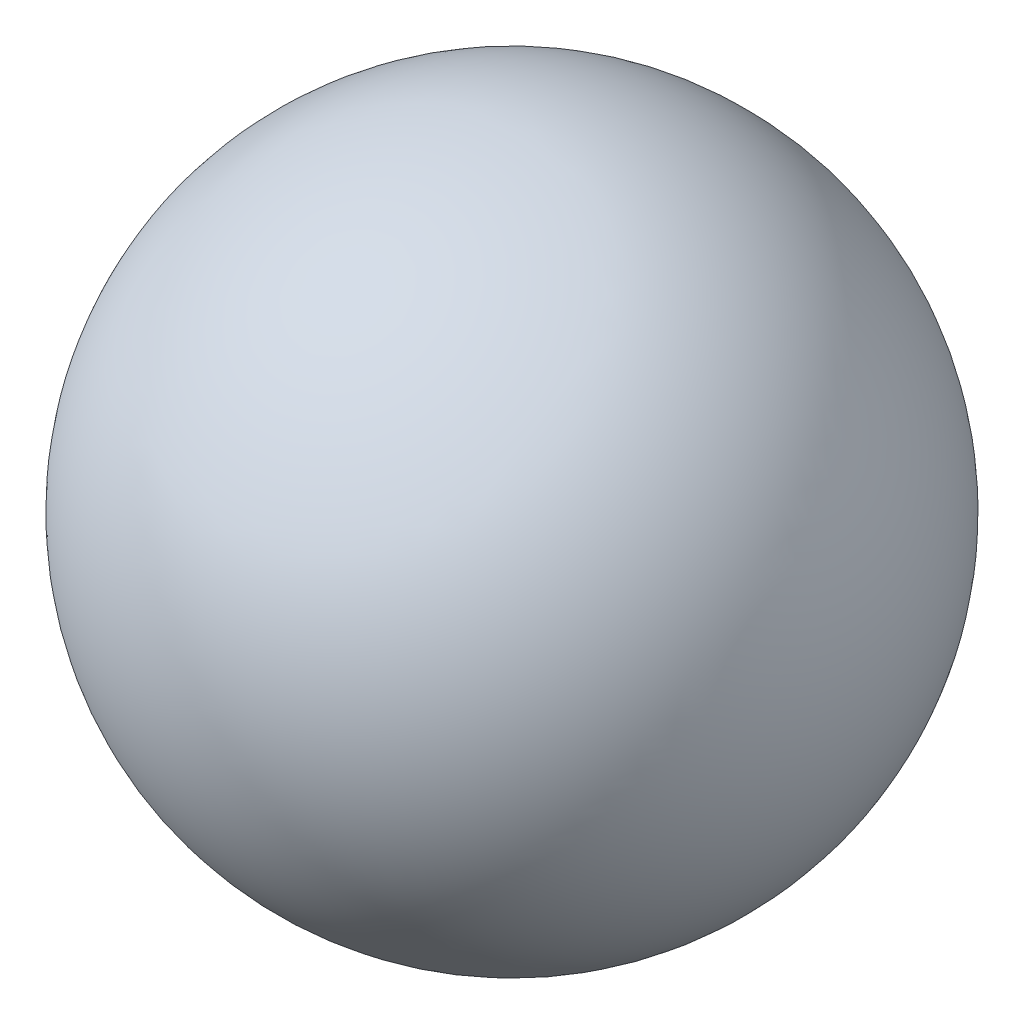
ISO-10303-21;
HEADER;
FILE_DESCRIPTION(('STEP AP214'),'2;1');
FILE_NAME('part.step','',(''),(''),'','','');
FILE_SCHEMA(('AUTOMOTIVE_DESIGN { 1 0 10303 214 1 1 1 1 }'));
ENDSEC;
DATA;
#1=APPLICATION_CONTEXT('core data for automotive mechanical design processes');
#2=APPLICATION_PROTOCOL_DEFINITION('international standard','automotive_design',2000,#1);
#3=PRODUCT_CONTEXT('',#1,'mechanical');
#4=PRODUCT('Part','Part','',(#3));
#5=PRODUCT_RELATED_PRODUCT_CATEGORY('part','',(#4));
#6=PRODUCT_DEFINITION_FORMATION('','',#4);
#7=PRODUCT_DEFINITION_CONTEXT('part definition',#1,'design');
#8=PRODUCT_DEFINITION('design','',#6,#7);
#9=PRODUCT_DEFINITION_SHAPE('','',#8);
#10=(LENGTH_UNIT() NAMED_UNIT(*) SI_UNIT(.MILLI.,.METRE.));
#11=(NAMED_UNIT(*) PLANE_ANGLE_UNIT() SI_UNIT($,.RADIAN.));
#12=(NAMED_UNIT(*) SI_UNIT($,.STERADIAN.) SOLID_ANGLE_UNIT());
#13=UNCERTAINTY_MEASURE_WITH_UNIT(LENGTH_MEASURE(1.E-05),#10,'distance_accuracy_value','');
#14=(GEOMETRIC_REPRESENTATION_CONTEXT(3) GLOBAL_UNCERTAINTY_ASSIGNED_CONTEXT((#13)) GLOBAL_UNIT_ASSIGNED_CONTEXT((#10,
#11,#12)) REPRESENTATION_CONTEXT('',''));
#15=CARTESIAN_POINT('',(0.,0.,0.));
#16=DIRECTION('',(0.,0.,1.));
#17=DIRECTION('',(1.,0.,0.));
#18=AXIS2_PLACEMENT_3D('',#15,#16,#17);
#19=CARTESIAN_POINT('',(0.,0.,0.));
#20=DIRECTION('',(-1.,0.,0.));
#21=DIRECTION('',(0.,1.,0.));
#22=AXIS2_PLACEMENT_3D('',#19,#20,#21);
#23=SPHERICAL_SURFACE('',#22,4.);
#24=CARTESIAN_POINT('',(-4.,0.,0.));
#25=VERTEX_POINT('',#24);
#26=VERTEX_LOOP('',#25);
#27=FACE_BOUND('',#26,.T.);
#28=ADVANCED_FACE('F34',(#27),#23,.T.);
#29=CLOSED_SHELL('',(#28));
#30=MANIFOLD_SOLID_BREP('B2',#29);
#31=ADVANCED_BREP_SHAPE_REPRESENTATION('',(#18,#30),#14);
#32=SHAPE_DEFINITION_REPRESENTATION(#9,#31);
ENDSEC;
END-ISO-10303-21;
